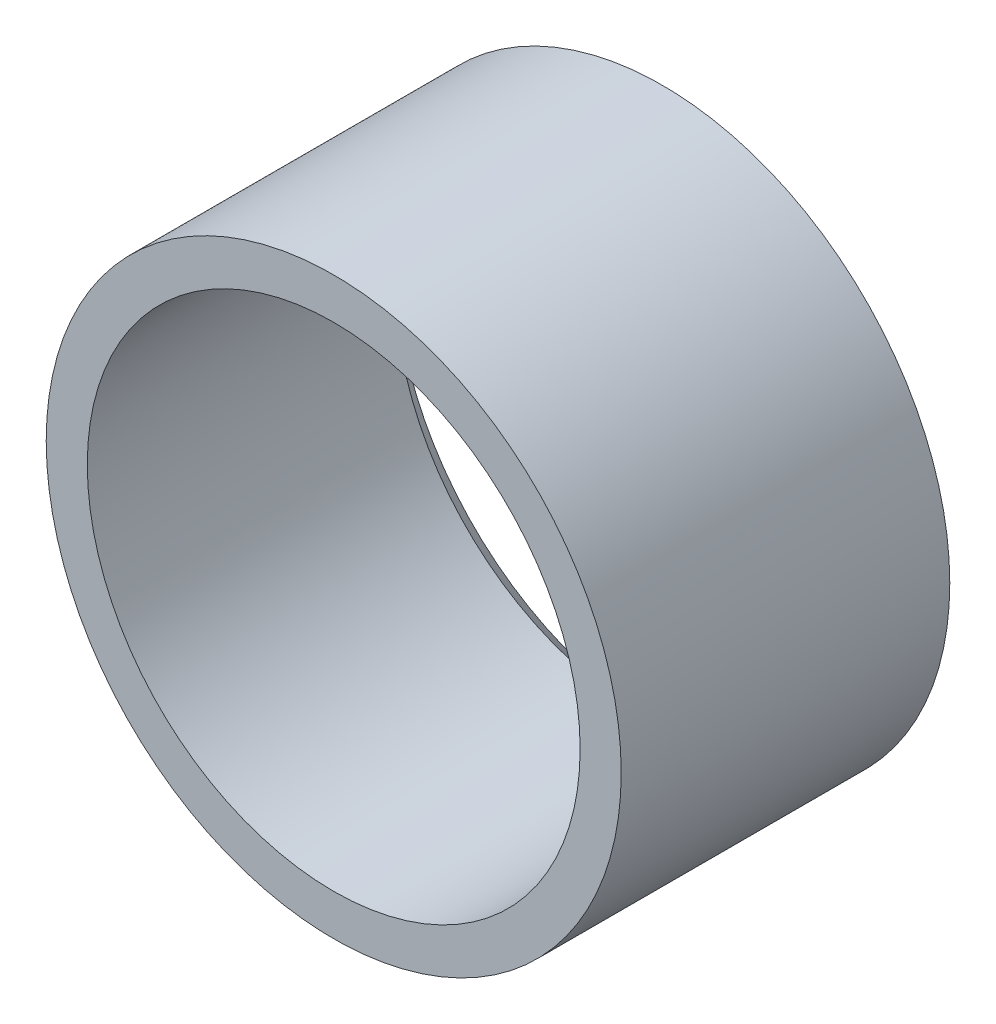
ISO-10303-21;
HEADER;
FILE_DESCRIPTION(('STEP AP214'),'2;1');
FILE_NAME('part.step','',(''),(''),'','','');
FILE_SCHEMA(('AUTOMOTIVE_DESIGN { 1 0 10303 214 1 1 1 1 }'));
ENDSEC;
DATA;
#1=APPLICATION_CONTEXT('core data for automotive mechanical design processes');
#2=APPLICATION_PROTOCOL_DEFINITION('international standard','automotive_design',2000,#1);
#3=PRODUCT_CONTEXT('',#1,'mechanical');
#4=PRODUCT('Part','Part','',(#3));
#5=PRODUCT_RELATED_PRODUCT_CATEGORY('part','',(#4));
#6=PRODUCT_DEFINITION_FORMATION('','',#4);
#7=PRODUCT_DEFINITION_CONTEXT('part definition',#1,'design');
#8=PRODUCT_DEFINITION('design','',#6,#7);
#9=PRODUCT_DEFINITION_SHAPE('','',#8);
#10=(LENGTH_UNIT() NAMED_UNIT(*) SI_UNIT(.MILLI.,.METRE.));
#11=(NAMED_UNIT(*) PLANE_ANGLE_UNIT() SI_UNIT($,.RADIAN.));
#12=(NAMED_UNIT(*) SI_UNIT($,.STERADIAN.) SOLID_ANGLE_UNIT());
#13=UNCERTAINTY_MEASURE_WITH_UNIT(LENGTH_MEASURE(1.E-05),#10,'distance_accuracy_value','');
#14=(GEOMETRIC_REPRESENTATION_CONTEXT(3) GLOBAL_UNCERTAINTY_ASSIGNED_CONTEXT((#13)) GLOBAL_UNIT_ASSIGNED_CONTEXT((#10,
#11,#12)) REPRESENTATION_CONTEXT('',''));
#15=CARTESIAN_POINT('',(0.,0.,0.));
#16=DIRECTION('',(0.,0.,1.));
#17=DIRECTION('',(1.,0.,0.));
#18=AXIS2_PLACEMENT_3D('',#15,#16,#17);
#19=CARTESIAN_POINT('',(0.,0.,8.));
#20=DIRECTION('',(0.,0.,1.));
#21=DIRECTION('',(1.,0.,0.));
#22=AXIS2_PLACEMENT_3D('',#19,#20,#21);
#23=PLANE('',#22);
#24=CARTESIAN_POINT('',(0.,0.,8.));
#25=DIRECTION('',(0.,0.,1.));
#26=DIRECTION('',(1.,0.,0.));
#27=AXIS2_PLACEMENT_3D('',#24,#25,#26);
#28=CIRCLE('',#27,7.);
#29=CARTESIAN_POINT('',(7.,0.,8.));
#30=VERTEX_POINT('',#29);
#31=EDGE_CURVE('E49',#30,#30,#28,.T.);
#32=ORIENTED_EDGE('',*,*,#31,.T.);
#33=EDGE_LOOP('',(#32));
#34=FACE_BOUND('',#33,.T.);
#35=CARTESIAN_POINT('',(0.,0.,8.));
#36=DIRECTION('',(0.,0.,1.));
#37=DIRECTION('',(1.,0.,0.));
#38=AXIS2_PLACEMENT_3D('',#35,#36,#37);
#39=CIRCLE('',#38,6.);
#40=CARTESIAN_POINT('',(6.,0.,8.));
#41=VERTEX_POINT('',#40);
#42=EDGE_CURVE('E57',#41,#41,#39,.T.);
#43=ORIENTED_EDGE('',*,*,#42,.F.);
#44=EDGE_LOOP('',(#43));
#45=FACE_BOUND('',#44,.T.);
#46=ADVANCED_FACE('F37',(#34,#45),#23,.T.);
#47=CARTESIAN_POINT('',(0.,0.,0.));
#48=DIRECTION('',(0.,0.,1.));
#49=DIRECTION('',(1.,0.,0.));
#50=AXIS2_PLACEMENT_3D('',#47,#48,#49);
#51=PLANE('',#50);
#52=CARTESIAN_POINT('',(0.,0.,0.));
#53=DIRECTION('',(0.,0.,1.));
#54=DIRECTION('',(1.,0.,0.));
#55=AXIS2_PLACEMENT_3D('',#52,#53,#54);
#56=CIRCLE('',#55,6.5);
#57=CARTESIAN_POINT('',(6.5,0.,0.));
#58=VERTEX_POINT('',#57);
#59=EDGE_CURVE('E45',#58,#58,#56,.T.);
#60=ORIENTED_EDGE('',*,*,#59,.T.);
#61=EDGE_LOOP('',(#60));
#62=FACE_BOUND('',#61,.T.);
#63=CARTESIAN_POINT('',(0.,0.,0.));
#64=DIRECTION('',(0.,0.,1.));
#65=DIRECTION('',(1.,0.,0.));
#66=AXIS2_PLACEMENT_3D('',#63,#64,#65);
#67=CIRCLE('',#66,7.);
#68=CARTESIAN_POINT('',(7.,0.,0.));
#69=VERTEX_POINT('',#68);
#70=EDGE_CURVE('E53',#69,#69,#67,.T.);
#71=ORIENTED_EDGE('',*,*,#70,.F.);
#72=EDGE_LOOP('',(#71));
#73=FACE_BOUND('',#72,.T.);
#74=ADVANCED_FACE('F65',(#62,#73),#51,.F.);
#75=CARTESIAN_POINT('',(0.,0.,8.));
#76=DIRECTION('',(0.,0.,-1.));
#77=DIRECTION('',(-1.,0.,0.));
#78=AXIS2_PLACEMENT_3D('',#75,#76,#77);
#79=CYLINDRICAL_SURFACE('',#78,7.);
#80=ORIENTED_EDGE('',*,*,#31,.F.);
#81=EDGE_LOOP('',(#80));
#82=FACE_BOUND('',#81,.T.);
#83=ORIENTED_EDGE('',*,*,#70,.T.);
#84=EDGE_LOOP('',(#83));
#85=FACE_BOUND('',#84,.T.);
#86=ADVANCED_FACE('F71',(#82,#85),#79,.T.);
#87=CARTESIAN_POINT('',(0.,0.,8.));
#88=DIRECTION('',(0.,0.,-1.));
#89=DIRECTION('',(-1.,0.,0.));
#90=AXIS2_PLACEMENT_3D('',#87,#88,#89);
#91=CYLINDRICAL_SURFACE('',#90,6.);
#92=CARTESIAN_POINT('',(0.,0.,0.500000000000004));
#93=DIRECTION('',(0.,0.,1.));
#94=DIRECTION('',(1.,0.,0.));
#95=AXIS2_PLACEMENT_3D('',#92,#93,#94);
#96=CIRCLE('',#95,6.);
#97=CARTESIAN_POINT('',(6.,0.,0.500000000000004));
#98=VERTEX_POINT('',#97);
#99=EDGE_CURVE('E10',#98,#98,#96,.F.);
#100=ORIENTED_EDGE('',*,*,#99,.T.);
#101=EDGE_LOOP('',(#100));
#102=FACE_BOUND('',#101,.T.);
#103=ORIENTED_EDGE('',*,*,#42,.T.);
#104=EDGE_LOOP('',(#103));
#105=FACE_BOUND('',#104,.T.);
#106=ADVANCED_FACE('F62',(#102,#105),#91,.F.);
#107=CARTESIAN_POINT('',(0.,0.,0.));
#108=DIRECTION('',(0.,0.,-1.));
#109=DIRECTION('',(-1.,0.,0.));
#110=AXIS2_PLACEMENT_3D('',#107,#108,#109);
#111=CONICAL_SURFACE('',#110,6.5,0.785398163397446);
#112=ORIENTED_EDGE('',*,*,#99,.F.);
#113=EDGE_LOOP('',(#112));
#114=FACE_BOUND('',#113,.T.);
#115=ORIENTED_EDGE('',*,*,#59,.F.);
#116=EDGE_LOOP('',(#115));
#117=FACE_BOUND('',#116,.T.);
#118=ADVANCED_FACE('F40',(#114,#117),#111,.F.);
#119=CLOSED_SHELL('',(#46,#74,#86,#106,#118));
#120=MANIFOLD_SOLID_BREP('B2',#119);
#121=ADVANCED_BREP_SHAPE_REPRESENTATION('',(#18,#120),#14);
#122=SHAPE_DEFINITION_REPRESENTATION(#9,#121);
ENDSEC;
END-ISO-10303-21;
